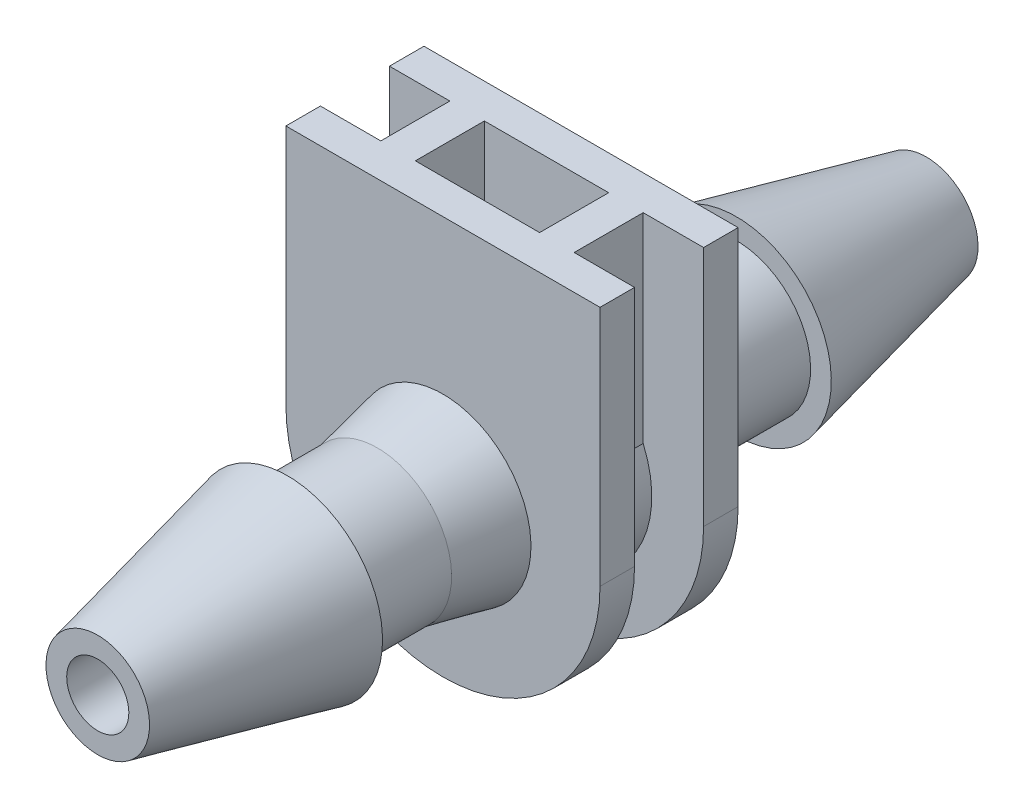
ISO-10303-21;
HEADER;
FILE_DESCRIPTION(('STEP AP214'),'2;1');
FILE_NAME('part.step','',(''),(''),'','','');
FILE_SCHEMA(('AUTOMOTIVE_DESIGN { 1 0 10303 214 1 1 1 1 }'));
ENDSEC;
DATA;
#1=APPLICATION_CONTEXT('core data for automotive mechanical design processes');
#2=APPLICATION_PROTOCOL_DEFINITION('international standard','automotive_design',2000,#1);
#3=PRODUCT_CONTEXT('',#1,'mechanical');
#4=PRODUCT('Part','Part','',(#3));
#5=PRODUCT_RELATED_PRODUCT_CATEGORY('part','',(#4));
#6=PRODUCT_DEFINITION_FORMATION('','',#4);
#7=PRODUCT_DEFINITION_CONTEXT('part definition',#1,'design');
#8=PRODUCT_DEFINITION('design','',#6,#7);
#9=PRODUCT_DEFINITION_SHAPE('','',#8);
#10=(LENGTH_UNIT() NAMED_UNIT(*) SI_UNIT(.MILLI.,.METRE.));
#11=(NAMED_UNIT(*) PLANE_ANGLE_UNIT() SI_UNIT($,.RADIAN.));
#12=(NAMED_UNIT(*) SI_UNIT($,.STERADIAN.) SOLID_ANGLE_UNIT());
#13=UNCERTAINTY_MEASURE_WITH_UNIT(LENGTH_MEASURE(1.E-05),#10,'distance_accuracy_value','');
#14=(GEOMETRIC_REPRESENTATION_CONTEXT(3) GLOBAL_UNCERTAINTY_ASSIGNED_CONTEXT((#13)) GLOBAL_UNIT_ASSIGNED_CONTEXT((#10,
#11,#12)) REPRESENTATION_CONTEXT('',''));
#15=CARTESIAN_POINT('',(0.,0.,0.));
#16=DIRECTION('',(0.,0.,1.));
#17=DIRECTION('',(1.,0.,0.));
#18=AXIS2_PLACEMENT_3D('',#15,#16,#17);
#19=CARTESIAN_POINT('',(0.,0.,12.));
#20=DIRECTION('',(0.,0.,1.));
#21=DIRECTION('',(0.,-1.,0.));
#22=AXIS2_PLACEMENT_3D('',#19,#20,#21);
#23=CYLINDRICAL_SURFACE('',#22,0.899999999999998);
#24=CARTESIAN_POINT('',(0.,0.,2.));
#25=DIRECTION('',(0.,0.,-1.));
#26=DIRECTION('',(-1.,0.,0.));
#27=AXIS2_PLACEMENT_3D('',#24,#25,#26);
#28=CIRCLE('',#27,0.899999999999998);
#29=CARTESIAN_POINT('',(0.899999999999998,0.,2.));
#30=VERTEX_POINT('',#29);
#31=CARTESIAN_POINT('',(-0.899999999999998,0.,2.));
#32=VERTEX_POINT('',#31);
#33=EDGE_CURVE('E286',#30,#32,#28,.F.);
#34=ORIENTED_EDGE('',*,*,#33,.F.);
#35=DIRECTION('',(0.,0.,1.));
#36=VECTOR('',#35,1.);
#37=CARTESIAN_POINT('',(0.899999999999998,0.,12.));
#38=LINE('',#37,#36);
#39=CARTESIAN_POINT('',(0.899999999999998,0.,1.));
#40=VERTEX_POINT('',#39);
#41=EDGE_CURVE('E288',#40,#30,#38,.T.);
#42=ORIENTED_EDGE('',*,*,#41,.F.);
#43=CARTESIAN_POINT('',(0.,0.,1.));
#44=DIRECTION('',(0.,0.,-1.));
#45=DIRECTION('',(-1.,0.,0.));
#46=AXIS2_PLACEMENT_3D('',#43,#44,#45);
#47=CIRCLE('',#46,0.899999999999998);
#48=CARTESIAN_POINT('',(-0.899999999999998,0.,1.));
#49=VERTEX_POINT('',#48);
#50=EDGE_CURVE('E294',#40,#49,#47,.F.);
#51=ORIENTED_EDGE('',*,*,#50,.T.);
#52=DIRECTION('',(0.,0.,1.));
#53=VECTOR('',#52,1.);
#54=CARTESIAN_POINT('',(-0.899999999999998,0.,12.));
#55=LINE('',#54,#53);
#56=EDGE_CURVE('E293',#32,#49,#55,.F.);
#57=ORIENTED_EDGE('',*,*,#56,.F.);
#58=EDGE_LOOP('',(#34,#42,#51,#57));
#59=FACE_BOUND('',#58,.T.);
#60=CARTESIAN_POINT('',(0.,0.,-12.));
#61=DIRECTION('',(0.,0.,1.));
#62=DIRECTION('',(0.,-1.,0.));
#63=AXIS2_PLACEMENT_3D('',#60,#61,#62);
#64=CIRCLE('',#63,0.899999999999996);
#65=CARTESIAN_POINT('',(0.,-0.899999999999992,-12.));
#66=VERTEX_POINT('',#65);
#67=EDGE_CURVE('E11',#66,#66,#64,.T.);
#68=ORIENTED_EDGE('',*,*,#67,.F.);
#69=EDGE_LOOP('',(#68));
#70=FACE_BOUND('',#69,.T.);
#71=CARTESIAN_POINT('',(0.,0.,12.));
#72=DIRECTION('',(0.,0.,1.));
#73=DIRECTION('',(0.,-1.,0.));
#74=AXIS2_PLACEMENT_3D('',#71,#72,#73);
#75=CIRCLE('',#74,0.9);
#76=CARTESIAN_POINT('',(0.,-0.9,12.));
#77=VERTEX_POINT('',#76);
#78=EDGE_CURVE('E312',#77,#77,#75,.T.);
#79=ORIENTED_EDGE('',*,*,#78,.T.);
#80=EDGE_LOOP('',(#79));
#81=FACE_BOUND('',#80,.T.);
#82=CARTESIAN_POINT('',(0.,0.,-2.));
#83=DIRECTION('',(0.,0.,1.));
#84=DIRECTION('',(1.,0.,0.));
#85=AXIS2_PLACEMENT_3D('',#82,#83,#84);
#86=CIRCLE('',#85,0.899999999999998);
#87=CARTESIAN_POINT('',(-0.899999999999998,0.,-2.));
#88=VERTEX_POINT('',#87);
#89=CARTESIAN_POINT('',(0.899999999999998,0.,-2.));
#90=VERTEX_POINT('',#89);
#91=EDGE_CURVE('E310',#88,#90,#86,.F.);
#92=ORIENTED_EDGE('',*,*,#91,.F.);
#93=CARTESIAN_POINT('',(-0.899999999999998,0.,-1.));
#94=VERTEX_POINT('',#93);
#95=EDGE_CURVE('E291',#94,#88,#55,.F.);
#96=ORIENTED_EDGE('',*,*,#95,.F.);
#97=CARTESIAN_POINT('',(0.,0.,-1.));
#98=DIRECTION('',(0.,0.,1.));
#99=DIRECTION('',(1.,0.,0.));
#100=AXIS2_PLACEMENT_3D('',#97,#98,#99);
#101=CIRCLE('',#100,0.899999999999998);
#102=CARTESIAN_POINT('',(0.899999999999998,0.,-1.));
#103=VERTEX_POINT('',#102);
#104=EDGE_CURVE('E307',#94,#103,#101,.F.);
#105=ORIENTED_EDGE('',*,*,#104,.T.);
#106=EDGE_CURVE('E290',#90,#103,#38,.T.);
#107=ORIENTED_EDGE('',*,*,#106,.F.);
#108=EDGE_LOOP('',(#92,#96,#105,#107));
#109=FACE_BOUND('',#108,.T.);
#110=ADVANCED_FACE('F33',(#59,#70,#81,#109),#23,.F.);
#111=CARTESIAN_POINT('',(0.,0.,12.));
#112=DIRECTION('',(0.,0.,1.));
#113=DIRECTION('',(0.,-1.,0.));
#114=AXIS2_PLACEMENT_3D('',#111,#112,#113);
#115=CYLINDRICAL_SURFACE('',#114,4.55);
#116=DIRECTION('',(0.,0.,1.));
#117=VECTOR('',#116,1.);
#118=CARTESIAN_POINT('',(-4.55,0.,-2.));
#119=LINE('',#118,#117);
#120=CARTESIAN_POINT('',(-4.55,0.,-2.));
#121=VERTEX_POINT('',#120);
#122=CARTESIAN_POINT('',(-4.55,0.,-1.));
#123=VERTEX_POINT('',#122);
#124=EDGE_CURVE('E238',#121,#123,#119,.T.);
#125=ORIENTED_EDGE('',*,*,#124,.F.);
#126=CARTESIAN_POINT('',(0.,0.,-2.));
#127=DIRECTION('',(0.,0.,1.));
#128=DIRECTION('',(0.,-1.,0.));
#129=AXIS2_PLACEMENT_3D('',#126,#127,#128);
#130=CIRCLE('',#129,4.55);
#131=CARTESIAN_POINT('',(4.55,0.,-2.));
#132=VERTEX_POINT('',#131);
#133=EDGE_CURVE('E346',#121,#132,#130,.T.);
#134=ORIENTED_EDGE('',*,*,#133,.T.);
#135=DIRECTION('',(0.,0.,-1.));
#136=VECTOR('',#135,1.);
#137=CARTESIAN_POINT('',(4.55,0.,-1.));
#138=LINE('',#137,#136);
#139=CARTESIAN_POINT('',(4.55,0.,-1.));
#140=VERTEX_POINT('',#139);
#141=EDGE_CURVE('E209',#140,#132,#138,.T.);
#142=ORIENTED_EDGE('',*,*,#141,.F.);
#143=CARTESIAN_POINT('',(0.,0.,-1.));
#144=DIRECTION('',(0.,0.,1.));
#145=DIRECTION('',(0.,-1.,0.));
#146=AXIS2_PLACEMENT_3D('',#143,#144,#145);
#147=CIRCLE('',#146,4.55);
#148=EDGE_CURVE('E343',#123,#140,#147,.T.);
#149=ORIENTED_EDGE('',*,*,#148,.F.);
#150=EDGE_LOOP('',(#125,#134,#142,#149));
#151=FACE_BOUND('',#150,.T.);
#152=ADVANCED_FACE('F372',(#151),#115,.T.);
#153=CARTESIAN_POINT('',(0.,4.55,-1.));
#154=DIRECTION('',(0.,0.,-1.));
#155=DIRECTION('',(0.,1.,0.));
#156=AXIS2_PLACEMENT_3D('',#153,#154,#155);
#157=PLANE('',#156);
#158=CARTESIAN_POINT('',(0.,0.,-1.));
#159=DIRECTION('',(0.,0.,1.));
#160=DIRECTION('',(0.,-1.,0.));
#161=AXIS2_PLACEMENT_3D('',#158,#159,#160);
#162=CIRCLE('',#161,3.05);
#163=CARTESIAN_POINT('',(-2.8,1.20933866224478,-1.));
#164=VERTEX_POINT('',#163);
#165=CARTESIAN_POINT('',(2.8,1.20933866224478,-1.));
#166=VERTEX_POINT('',#165);
#167=EDGE_CURVE('E340',#164,#166,#162,.T.);
#168=ORIENTED_EDGE('',*,*,#167,.F.);
#169=DIRECTION('',(0.,-1.,0.));
#170=VECTOR('',#169,1.);
#171=CARTESIAN_POINT('',(-2.8,7.,-1.));
#172=LINE('',#171,#170);
#173=CARTESIAN_POINT('',(-2.8,7.,-1.));
#174=VERTEX_POINT('',#173);
#175=EDGE_CURVE('E277',#174,#164,#172,.T.);
#176=ORIENTED_EDGE('',*,*,#175,.F.);
#177=DIRECTION('',(1.,0.,0.));
#178=VECTOR('',#177,1.);
#179=CARTESIAN_POINT('',(-4.55,7.,-1.));
#180=LINE('',#179,#178);
#181=CARTESIAN_POINT('',(-4.55,7.,-1.));
#182=VERTEX_POINT('',#181);
#183=EDGE_CURVE('E211',#182,#174,#180,.T.);
#184=ORIENTED_EDGE('',*,*,#183,.F.);
#185=DIRECTION('',(0.,-1.,0.));
#186=VECTOR('',#185,1.);
#187=CARTESIAN_POINT('',(-4.55,7.,-1.));
#188=LINE('',#187,#186);
#189=EDGE_CURVE('E280',#182,#123,#188,.T.);
#190=ORIENTED_EDGE('',*,*,#189,.T.);
#191=ORIENTED_EDGE('',*,*,#148,.T.);
#192=DIRECTION('',(0.,-1.,0.));
#193=VECTOR('',#192,1.);
#194=CARTESIAN_POINT('',(4.55,7.,-1.));
#195=LINE('',#194,#193);
#196=CARTESIAN_POINT('',(4.55,7.,-1.));
#197=VERTEX_POINT('',#196);
#198=EDGE_CURVE('E254',#197,#140,#195,.T.);
#199=ORIENTED_EDGE('',*,*,#198,.F.);
#200=DIRECTION('',(1.,0.,0.));
#201=VECTOR('',#200,1.);
#202=CARTESIAN_POINT('',(2.8,7.,-1.));
#203=LINE('',#202,#201);
#204=CARTESIAN_POINT('',(2.8,7.,-1.));
#205=VERTEX_POINT('',#204);
#206=EDGE_CURVE('E231',#205,#197,#203,.T.);
#207=ORIENTED_EDGE('',*,*,#206,.F.);
#208=DIRECTION('',(0.,-1.,0.));
#209=VECTOR('',#208,1.);
#210=CARTESIAN_POINT('',(2.8,7.,-1.));
#211=LINE('',#210,#209);
#212=EDGE_CURVE('E257',#205,#166,#211,.T.);
#213=ORIENTED_EDGE('',*,*,#212,.T.);
#214=EDGE_LOOP('',(#168,#176,#184,#190,#191,#199,#207,#213));
#215=FACE_BOUND('',#214,.T.);
#216=ADVANCED_FACE('F472',(#215),#157,.F.);
#217=CARTESIAN_POINT('',(0.,0.,12.));
#218=DIRECTION('',(0.,0.,1.));
#219=DIRECTION('',(0.,-1.,0.));
#220=AXIS2_PLACEMENT_3D('',#217,#218,#219);
#221=CYLINDRICAL_SURFACE('',#220,3.05);
#222=DIRECTION('',(0.,0.,1.));
#223=VECTOR('',#222,1.);
#224=CARTESIAN_POINT('',(-2.8,1.20933866224477,12.));
#225=LINE('',#224,#223);
#226=CARTESIAN_POINT('',(-2.8,1.20933866224478,1.));
#227=VERTEX_POINT('',#226);
#228=EDGE_CURVE('E304',#164,#227,#225,.T.);
#229=ORIENTED_EDGE('',*,*,#228,.F.);
#230=ORIENTED_EDGE('',*,*,#167,.T.);
#231=DIRECTION('',(0.,0.,1.));
#232=VECTOR('',#231,1.);
#233=CARTESIAN_POINT('',(2.8,1.20933866224477,12.));
#234=LINE('',#233,#232);
#235=CARTESIAN_POINT('',(2.8,1.20933866224478,1.));
#236=VERTEX_POINT('',#235);
#237=EDGE_CURVE('E301',#236,#166,#234,.F.);
#238=ORIENTED_EDGE('',*,*,#237,.F.);
#239=CARTESIAN_POINT('',(0.,0.,1.));
#240=DIRECTION('',(0.,0.,1.));
#241=DIRECTION('',(0.,-1.,0.));
#242=AXIS2_PLACEMENT_3D('',#239,#240,#241);
#243=CIRCLE('',#242,3.05);
#244=EDGE_CURVE('E336',#227,#236,#243,.T.);
#245=ORIENTED_EDGE('',*,*,#244,.F.);
#246=EDGE_LOOP('',(#229,#230,#238,#245));
#247=FACE_BOUND('',#246,.T.);
#248=ADVANCED_FACE('F469',(#247),#221,.T.);
#249=CARTESIAN_POINT('',(0.,4.55,1.));
#250=DIRECTION('',(0.,0.,1.));
#251=DIRECTION('',(0.,-1.,0.));
#252=AXIS2_PLACEMENT_3D('',#249,#250,#251);
#253=PLANE('',#252);
#254=DIRECTION('',(0.,-1.,0.));
#255=VECTOR('',#254,1.);
#256=CARTESIAN_POINT('',(-2.8,7.,1.));
#257=LINE('',#256,#255);
#258=CARTESIAN_POINT('',(-2.8,7.,1.));
#259=VERTEX_POINT('',#258);
#260=EDGE_CURVE('E274',#259,#227,#257,.T.);
#261=ORIENTED_EDGE('',*,*,#260,.T.);
#262=ORIENTED_EDGE('',*,*,#244,.T.);
#263=DIRECTION('',(0.,-1.,0.));
#264=VECTOR('',#263,1.);
#265=CARTESIAN_POINT('',(2.8,7.,1.));
#266=LINE('',#265,#264);
#267=CARTESIAN_POINT('',(2.8,7.,1.));
#268=VERTEX_POINT('',#267);
#269=EDGE_CURVE('E259',#268,#236,#266,.T.);
#270=ORIENTED_EDGE('',*,*,#269,.F.);
#271=DIRECTION('',(-1.,0.,0.));
#272=VECTOR('',#271,1.);
#273=CARTESIAN_POINT('',(4.55,7.,1.));
#274=LINE('',#273,#272);
#275=CARTESIAN_POINT('',(4.55,7.,1.));
#276=VERTEX_POINT('',#275);
#277=EDGE_CURVE('E225',#276,#268,#274,.T.);
#278=ORIENTED_EDGE('',*,*,#277,.F.);
#279=DIRECTION('',(0.,-1.,0.));
#280=VECTOR('',#279,1.);
#281=CARTESIAN_POINT('',(4.55,7.,1.));
#282=LINE('',#281,#280);
#283=CARTESIAN_POINT('',(4.55,0.,1.));
#284=VERTEX_POINT('',#283);
#285=EDGE_CURVE('E262',#276,#284,#282,.T.);
#286=ORIENTED_EDGE('',*,*,#285,.T.);
#287=CARTESIAN_POINT('',(0.,0.,1.));
#288=DIRECTION('',(0.,0.,1.));
#289=DIRECTION('',(0.,-1.,0.));
#290=AXIS2_PLACEMENT_3D('',#287,#288,#289);
#291=CIRCLE('',#290,4.55);
#292=CARTESIAN_POINT('',(-4.55,0.,1.));
#293=VERTEX_POINT('',#292);
#294=EDGE_CURVE('E333',#293,#284,#291,.T.);
#295=ORIENTED_EDGE('',*,*,#294,.F.);
#296=DIRECTION('',(0.,-1.,0.));
#297=VECTOR('',#296,1.);
#298=CARTESIAN_POINT('',(-4.55,7.,1.));
#299=LINE('',#298,#297);
#300=CARTESIAN_POINT('',(-4.55,7.,1.));
#301=VERTEX_POINT('',#300);
#302=EDGE_CURVE('E271',#301,#293,#299,.T.);
#303=ORIENTED_EDGE('',*,*,#302,.F.);
#304=DIRECTION('',(-1.,0.,0.));
#305=VECTOR('',#304,1.);
#306=CARTESIAN_POINT('',(-2.8,7.,1.));
#307=LINE('',#306,#305);
#308=EDGE_CURVE('E217',#259,#301,#307,.T.);
#309=ORIENTED_EDGE('',*,*,#308,.F.);
#310=EDGE_LOOP('',(#261,#262,#270,#278,#286,#295,#303,#309));
#311=FACE_BOUND('',#310,.T.);
#312=ADVANCED_FACE('F459',(#311),#253,.F.);
#313=CARTESIAN_POINT('',(0.,0.,12.));
#314=DIRECTION('',(0.,0.,1.));
#315=DIRECTION('',(0.,-1.,0.));
#316=AXIS2_PLACEMENT_3D('',#313,#314,#315);
#317=CYLINDRICAL_SURFACE('',#316,4.55);
#318=DIRECTION('',(0.,0.,1.));
#319=VECTOR('',#318,1.);
#320=CARTESIAN_POINT('',(-4.55,0.,1.));
#321=LINE('',#320,#319);
#322=CARTESIAN_POINT('',(-4.55,0.,2.));
#323=VERTEX_POINT('',#322);
#324=EDGE_CURVE('E241',#293,#323,#321,.T.);
#325=ORIENTED_EDGE('',*,*,#324,.F.);
#326=ORIENTED_EDGE('',*,*,#294,.T.);
#327=DIRECTION('',(0.,0.,-1.));
#328=VECTOR('',#327,1.);
#329=CARTESIAN_POINT('',(4.55,0.,2.));
#330=LINE('',#329,#328);
#331=CARTESIAN_POINT('',(4.55,0.,2.));
#332=VERTEX_POINT('',#331);
#333=EDGE_CURVE('E247',#332,#284,#330,.T.);
#334=ORIENTED_EDGE('',*,*,#333,.F.);
#335=CARTESIAN_POINT('',(0.,0.,2.));
#336=DIRECTION('',(0.,0.,1.));
#337=DIRECTION('',(0.,-1.,0.));
#338=AXIS2_PLACEMENT_3D('',#335,#336,#337);
#339=CIRCLE('',#338,4.55);
#340=EDGE_CURVE('E330',#323,#332,#339,.T.);
#341=ORIENTED_EDGE('',*,*,#340,.F.);
#342=EDGE_LOOP('',(#325,#326,#334,#341));
#343=FACE_BOUND('',#342,.T.);
#344=ADVANCED_FACE('F367',(#343),#317,.T.);
#345=CARTESIAN_POINT('',(0.,1.5,-12.));
#346=DIRECTION('',(0.,0.,1.));
#347=DIRECTION('',(0.,-1.,0.));
#348=AXIS2_PLACEMENT_3D('',#345,#346,#347);
#349=PLANE('',#348);
#350=CARTESIAN_POINT('',(0.,0.,-12.));
#351=DIRECTION('',(0.,0.,1.));
#352=DIRECTION('',(0.,-1.,0.));
#353=AXIS2_PLACEMENT_3D('',#350,#351,#352);
#354=CIRCLE('',#353,1.5);
#355=CARTESIAN_POINT('',(0.,-1.49999999999999,-12.));
#356=VERTEX_POINT('',#355);
#357=EDGE_CURVE('E40',#356,#356,#354,.T.);
#358=ORIENTED_EDGE('',*,*,#357,.F.);
#359=EDGE_LOOP('',(#358));
#360=FACE_BOUND('',#359,.T.);
#361=ORIENTED_EDGE('',*,*,#67,.T.);
#362=EDGE_LOOP('',(#361));
#363=FACE_BOUND('',#362,.T.);
#364=ADVANCED_FACE('F364',(#360,#363),#349,.F.);
#365=CARTESIAN_POINT('',(0.,0.,-12.));
#366=DIRECTION('',(0.,0.,1.));
#367=DIRECTION('',(0.,-1.,0.));
#368=AXIS2_PLACEMENT_3D('',#365,#366,#367);
#369=CONICAL_SURFACE('',#368,1.5,0.223476601140633);
#370=CARTESIAN_POINT('',(0.,0.,-6.5));
#371=DIRECTION('',(0.,0.,1.));
#372=DIRECTION('',(0.,-1.,0.));
#373=AXIS2_PLACEMENT_3D('',#370,#371,#372);
#374=CIRCLE('',#373,2.75);
#375=CARTESIAN_POINT('',(0.,-2.74999999999999,-6.5));
#376=VERTEX_POINT('',#375);
#377=EDGE_CURVE('E357',#376,#376,#374,.T.);
#378=ORIENTED_EDGE('',*,*,#377,.F.);
#379=EDGE_LOOP('',(#378));
#380=FACE_BOUND('',#379,.T.);
#381=ORIENTED_EDGE('',*,*,#357,.T.);
#382=EDGE_LOOP('',(#381));
#383=FACE_BOUND('',#382,.T.);
#384=ADVANCED_FACE('F362',(#380,#383),#369,.T.);
#385=CARTESIAN_POINT('',(0.,2.75,-6.5));
#386=DIRECTION('',(0.,0.,-1.));
#387=DIRECTION('',(0.,1.,0.));
#388=AXIS2_PLACEMENT_3D('',#385,#386,#387);
#389=PLANE('',#388);
#390=CARTESIAN_POINT('',(0.,0.,-6.5));
#391=DIRECTION('',(0.,0.,1.));
#392=DIRECTION('',(0.,-1.,0.));
#393=AXIS2_PLACEMENT_3D('',#390,#391,#392);
#394=CIRCLE('',#393,2.15);
#395=CARTESIAN_POINT('',(0.,-2.14999999999999,-6.5));
#396=VERTEX_POINT('',#395);
#397=EDGE_CURVE('E354',#396,#396,#394,.T.);
#398=ORIENTED_EDGE('',*,*,#397,.F.);
#399=EDGE_LOOP('',(#398));
#400=FACE_BOUND('',#399,.T.);
#401=ORIENTED_EDGE('',*,*,#377,.T.);
#402=EDGE_LOOP('',(#401));
#403=FACE_BOUND('',#402,.T.);
#404=ADVANCED_FACE('F486',(#400,#403),#389,.F.);
#405=CARTESIAN_POINT('',(0.,0.,12.));
#406=DIRECTION('',(0.,0.,1.));
#407=DIRECTION('',(0.,-1.,0.));
#408=AXIS2_PLACEMENT_3D('',#405,#406,#407);
#409=CYLINDRICAL_SURFACE('',#408,2.15);
#410=CARTESIAN_POINT('',(0.,0.,-3.9));
#411=DIRECTION('',(0.,0.,1.));
#412=DIRECTION('',(0.,-1.,0.));
#413=AXIS2_PLACEMENT_3D('',#410,#411,#412);
#414=CIRCLE('',#413,2.15);
#415=CARTESIAN_POINT('',(0.,-2.14999999999999,-3.9));
#416=VERTEX_POINT('',#415);
#417=EDGE_CURVE('E351',#416,#416,#414,.T.);
#418=ORIENTED_EDGE('',*,*,#417,.F.);
#419=EDGE_LOOP('',(#418));
#420=FACE_BOUND('',#419,.T.);
#421=ORIENTED_EDGE('',*,*,#397,.T.);
#422=EDGE_LOOP('',(#421));
#423=FACE_BOUND('',#422,.T.);
#424=ADVANCED_FACE('F482',(#420,#423),#409,.T.);
#425=CARTESIAN_POINT('',(0.,0.,-3.9));
#426=DIRECTION('',(0.,0.,1.));
#427=DIRECTION('',(0.,-1.,0.));
#428=AXIS2_PLACEMENT_3D('',#425,#426,#427);
#429=CONICAL_SURFACE('',#428,2.15,0.207496226435205);
#430=CARTESIAN_POINT('',(0.,0.,-2.00000000000001));
#431=DIRECTION('',(0.,0.,1.));
#432=DIRECTION('',(0.,-1.,0.));
#433=AXIS2_PLACEMENT_3D('',#430,#431,#432);
#434=CIRCLE('',#433,2.55);
#435=CARTESIAN_POINT('',(0.,-2.55,-2.00000000000001));
#436=VERTEX_POINT('',#435);
#437=EDGE_CURVE('E348',#436,#436,#434,.T.);
#438=ORIENTED_EDGE('',*,*,#437,.F.);
#439=EDGE_LOOP('',(#438));
#440=FACE_BOUND('',#439,.T.);
#441=ORIENTED_EDGE('',*,*,#417,.T.);
#442=EDGE_LOOP('',(#441));
#443=FACE_BOUND('',#442,.T.);
#444=ADVANCED_FACE('F478',(#440,#443),#429,.T.);
#445=CARTESIAN_POINT('',(0.,4.55,-2.00000000000001));
#446=DIRECTION('',(0.,0.,1.));
#447=DIRECTION('',(0.,-1.,0.));
#448=AXIS2_PLACEMENT_3D('',#445,#446,#447);
#449=PLANE('',#448);
#450=ORIENTED_EDGE('',*,*,#437,.T.);
#451=EDGE_LOOP('',(#450));
#452=FACE_BOUND('',#451,.T.);
#453=DIRECTION('',(0.,-1.,0.));
#454=VECTOR('',#453,1.);
#455=CARTESIAN_POINT('',(4.55,7.,-2.));
#456=LINE('',#455,#454);
#457=CARTESIAN_POINT('',(4.55,7.,-2.));
#458=VERTEX_POINT('',#457);
#459=EDGE_CURVE('E235',#458,#132,#456,.T.);
#460=ORIENTED_EDGE('',*,*,#459,.T.);
#461=ORIENTED_EDGE('',*,*,#133,.F.);
#462=DIRECTION('',(0.,-1.,0.));
#463=VECTOR('',#462,1.);
#464=CARTESIAN_POINT('',(-4.55,7.,-2.));
#465=LINE('',#464,#463);
#466=CARTESIAN_POINT('',(-4.55,7.,-2.));
#467=VERTEX_POINT('',#466);
#468=EDGE_CURVE('E283',#467,#121,#465,.T.);
#469=ORIENTED_EDGE('',*,*,#468,.F.);
#470=DIRECTION('',(-1.,0.,0.));
#471=VECTOR('',#470,1.);
#472=CARTESIAN_POINT('',(4.55,7.,-2.));
#473=LINE('',#472,#471);
#474=EDGE_CURVE('E205',#458,#467,#473,.T.);
#475=ORIENTED_EDGE('',*,*,#474,.F.);
#476=EDGE_LOOP('',(#460,#461,#469,#475));
#477=FACE_BOUND('',#476,.T.);
#478=ADVANCED_FACE('F455',(#452,#477),#449,.F.);
#479=CARTESIAN_POINT('',(0.,4.55,2.00000000000001));
#480=DIRECTION('',(0.,0.,-1.));
#481=DIRECTION('',(0.,1.,0.));
#482=AXIS2_PLACEMENT_3D('',#479,#480,#481);
#483=PLANE('',#482);
#484=CARTESIAN_POINT('',(0.,0.,2.00000000000001));
#485=DIRECTION('',(0.,0.,1.));
#486=DIRECTION('',(0.,-1.,0.));
#487=AXIS2_PLACEMENT_3D('',#484,#485,#486);
#488=CIRCLE('',#487,2.55);
#489=CARTESIAN_POINT('',(0.,-2.55,2.00000000000001));
#490=VERTEX_POINT('',#489);
#491=EDGE_CURVE('E327',#490,#490,#488,.T.);
#492=ORIENTED_EDGE('',*,*,#491,.F.);
#493=EDGE_LOOP('',(#492));
#494=FACE_BOUND('',#493,.T.);
#495=ORIENTED_EDGE('',*,*,#340,.T.);
#496=DIRECTION('',(0.,-1.,0.));
#497=VECTOR('',#496,1.);
#498=CARTESIAN_POINT('',(4.55,7.,2.));
#499=LINE('',#498,#497);
#500=CARTESIAN_POINT('',(4.55,7.,2.));
#501=VERTEX_POINT('',#500);
#502=EDGE_CURVE('E265',#501,#332,#499,.T.);
#503=ORIENTED_EDGE('',*,*,#502,.F.);
#504=DIRECTION('',(1.,0.,0.));
#505=VECTOR('',#504,1.);
#506=CARTESIAN_POINT('',(-4.55,7.,2.));
#507=LINE('',#506,#505);
#508=CARTESIAN_POINT('',(-4.55,7.,2.));
#509=VERTEX_POINT('',#508);
#510=EDGE_CURVE('E221',#509,#501,#507,.T.);
#511=ORIENTED_EDGE('',*,*,#510,.F.);
#512=DIRECTION('',(0.,-1.,0.));
#513=VECTOR('',#512,1.);
#514=CARTESIAN_POINT('',(-4.55,7.,2.));
#515=LINE('',#514,#513);
#516=EDGE_CURVE('E268',#509,#323,#515,.T.);
#517=ORIENTED_EDGE('',*,*,#516,.T.);
#518=EDGE_LOOP('',(#495,#503,#511,#517));
#519=FACE_BOUND('',#518,.T.);
#520=ADVANCED_FACE('F451',(#494,#519),#483,.F.);
#521=CARTESIAN_POINT('',(0.,0.,2.00000000000001));
#522=DIRECTION('',(0.,0.,-1.));
#523=DIRECTION('',(0.,1.,0.));
#524=AXIS2_PLACEMENT_3D('',#521,#522,#523);
#525=CONICAL_SURFACE('',#524,2.55,0.207496226435204);
#526=CARTESIAN_POINT('',(0.,0.,3.9));
#527=DIRECTION('',(0.,0.,1.));
#528=DIRECTION('',(0.,-1.,0.));
#529=AXIS2_PLACEMENT_3D('',#526,#527,#528);
#530=CIRCLE('',#529,2.15);
#531=CARTESIAN_POINT('',(0.,-2.15,3.9));
#532=VERTEX_POINT('',#531);
#533=EDGE_CURVE('E324',#532,#532,#530,.T.);
#534=ORIENTED_EDGE('',*,*,#533,.F.);
#535=EDGE_LOOP('',(#534));
#536=FACE_BOUND('',#535,.T.);
#537=ORIENTED_EDGE('',*,*,#491,.T.);
#538=EDGE_LOOP('',(#537));
#539=FACE_BOUND('',#538,.T.);
#540=ADVANCED_FACE('F447',(#536,#539),#525,.T.);
#541=CARTESIAN_POINT('',(0.,0.,12.));
#542=DIRECTION('',(0.,0.,1.));
#543=DIRECTION('',(0.,-1.,0.));
#544=AXIS2_PLACEMENT_3D('',#541,#542,#543);
#545=CYLINDRICAL_SURFACE('',#544,2.15);
#546=CARTESIAN_POINT('',(0.,0.,6.5));
#547=DIRECTION('',(0.,0.,1.));
#548=DIRECTION('',(0.,-1.,0.));
#549=AXIS2_PLACEMENT_3D('',#546,#547,#548);
#550=CIRCLE('',#549,2.15);
#551=CARTESIAN_POINT('',(0.,-2.15,6.5));
#552=VERTEX_POINT('',#551);
#553=EDGE_CURVE('E321',#552,#552,#550,.T.);
#554=ORIENTED_EDGE('',*,*,#553,.F.);
#555=EDGE_LOOP('',(#554));
#556=FACE_BOUND('',#555,.T.);
#557=ORIENTED_EDGE('',*,*,#533,.T.);
#558=EDGE_LOOP('',(#557));
#559=FACE_BOUND('',#558,.T.);
#560=ADVANCED_FACE('F443',(#556,#559),#545,.T.);
#561=CARTESIAN_POINT('',(0.,2.75,6.5));
#562=DIRECTION('',(0.,0.,1.));
#563=DIRECTION('',(0.,-1.,0.));
#564=AXIS2_PLACEMENT_3D('',#561,#562,#563);
#565=PLANE('',#564);
#566=CARTESIAN_POINT('',(0.,0.,6.5));
#567=DIRECTION('',(0.,0.,1.));
#568=DIRECTION('',(0.,-1.,0.));
#569=AXIS2_PLACEMENT_3D('',#566,#567,#568);
#570=CIRCLE('',#569,2.75);
#571=CARTESIAN_POINT('',(0.,-2.75,6.5));
#572=VERTEX_POINT('',#571);
#573=EDGE_CURVE('E318',#572,#572,#570,.T.);
#574=ORIENTED_EDGE('',*,*,#573,.F.);
#575=EDGE_LOOP('',(#574));
#576=FACE_BOUND('',#575,.T.);
#577=ORIENTED_EDGE('',*,*,#553,.T.);
#578=EDGE_LOOP('',(#577));
#579=FACE_BOUND('',#578,.T.);
#580=ADVANCED_FACE('F439',(#576,#579),#565,.F.);
#581=CARTESIAN_POINT('',(0.,0.,6.5));
#582=DIRECTION('',(0.,0.,-1.));
#583=DIRECTION('',(0.,1.,0.));
#584=AXIS2_PLACEMENT_3D('',#581,#582,#583);
#585=CONICAL_SURFACE('',#584,2.75,0.223476601140633);
#586=CARTESIAN_POINT('',(0.,0.,12.));
#587=DIRECTION('',(0.,0.,1.));
#588=DIRECTION('',(0.,-1.,0.));
#589=AXIS2_PLACEMENT_3D('',#586,#587,#588);
#590=CIRCLE('',#589,1.5);
#591=CARTESIAN_POINT('',(0.,-1.5,12.));
#592=VERTEX_POINT('',#591);
#593=EDGE_CURVE('E315',#592,#592,#590,.T.);
#594=ORIENTED_EDGE('',*,*,#593,.F.);
#595=EDGE_LOOP('',(#594));
#596=FACE_BOUND('',#595,.T.);
#597=ORIENTED_EDGE('',*,*,#573,.T.);
#598=EDGE_LOOP('',(#597));
#599=FACE_BOUND('',#598,.T.);
#600=ADVANCED_FACE('F435',(#596,#599),#585,.T.);
#601=CARTESIAN_POINT('',(0.,1.5,12.));
#602=DIRECTION('',(0.,0.,-1.));
#603=DIRECTION('',(0.,1.,0.));
#604=AXIS2_PLACEMENT_3D('',#601,#602,#603);
#605=PLANE('',#604);
#606=ORIENTED_EDGE('',*,*,#78,.F.);
#607=EDGE_LOOP('',(#606));
#608=FACE_BOUND('',#607,.T.);
#609=ORIENTED_EDGE('',*,*,#593,.T.);
#610=EDGE_LOOP('',(#609));
#611=FACE_BOUND('',#610,.T.);
#612=ADVANCED_FACE('F409',(#608,#611),#605,.F.);
#613=CARTESIAN_POINT('',(4.55,7.,-1.));
#614=DIRECTION('',(-1.,0.,0.));
#615=DIRECTION('',(0.,0.,1.));
#616=AXIS2_PLACEMENT_3D('',#613,#614,#615);
#617=PLANE('',#616);
#618=ORIENTED_EDGE('',*,*,#141,.T.);
#619=ORIENTED_EDGE('',*,*,#459,.F.);
#620=DIRECTION('',(0.,0.,-1.));
#621=VECTOR('',#620,1.);
#622=CARTESIAN_POINT('',(4.55,7.,-1.));
#623=LINE('',#622,#621);
#624=EDGE_CURVE('E233',#197,#458,#623,.T.);
#625=ORIENTED_EDGE('',*,*,#624,.F.);
#626=ORIENTED_EDGE('',*,*,#198,.T.);
#627=EDGE_LOOP('',(#618,#619,#625,#626));
#628=FACE_BOUND('',#627,.T.);
#629=ADVANCED_FACE('F405',(#628),#617,.F.);
#630=CARTESIAN_POINT('',(4.55,7.,2.));
#631=DIRECTION('',(-1.,0.,0.));
#632=DIRECTION('',(0.,0.,1.));
#633=AXIS2_PLACEMENT_3D('',#630,#631,#632);
#634=PLANE('',#633);
#635=ORIENTED_EDGE('',*,*,#333,.T.);
#636=ORIENTED_EDGE('',*,*,#285,.F.);
#637=DIRECTION('',(0.,0.,-1.));
#638=VECTOR('',#637,1.);
#639=CARTESIAN_POINT('',(4.55,7.,2.));
#640=LINE('',#639,#638);
#641=EDGE_CURVE('E223',#501,#276,#640,.T.);
#642=ORIENTED_EDGE('',*,*,#641,.F.);
#643=ORIENTED_EDGE('',*,*,#502,.T.);
#644=EDGE_LOOP('',(#635,#636,#642,#643));
#645=FACE_BOUND('',#644,.T.);
#646=ADVANCED_FACE('F408',(#645),#634,.F.);
#647=CARTESIAN_POINT('',(-4.55,7.,1.));
#648=DIRECTION('',(1.,0.,0.));
#649=DIRECTION('',(0.,0.,-1.));
#650=AXIS2_PLACEMENT_3D('',#647,#648,#649);
#651=PLANE('',#650);
#652=ORIENTED_EDGE('',*,*,#324,.T.);
#653=ORIENTED_EDGE('',*,*,#516,.F.);
#654=DIRECTION('',(0.,0.,1.));
#655=VECTOR('',#654,1.);
#656=CARTESIAN_POINT('',(-4.55,7.,1.));
#657=LINE('',#656,#655);
#658=EDGE_CURVE('E219',#301,#509,#657,.T.);
#659=ORIENTED_EDGE('',*,*,#658,.F.);
#660=ORIENTED_EDGE('',*,*,#302,.T.);
#661=EDGE_LOOP('',(#652,#653,#659,#660));
#662=FACE_BOUND('',#661,.T.);
#663=ADVANCED_FACE('F415',(#662),#651,.F.);
#664=CARTESIAN_POINT('',(2.8,7.,1.));
#665=DIRECTION('',(-1.,0.,0.));
#666=DIRECTION('',(0.,0.,1.));
#667=AXIS2_PLACEMENT_3D('',#664,#665,#666);
#668=PLANE('',#667);
#669=ORIENTED_EDGE('',*,*,#269,.T.);
#670=ORIENTED_EDGE('',*,*,#237,.T.);
#671=ORIENTED_EDGE('',*,*,#212,.F.);
#672=DIRECTION('',(0.,0.,-1.));
#673=VECTOR('',#672,1.);
#674=CARTESIAN_POINT('',(2.8,7.,1.));
#675=LINE('',#674,#673);
#676=EDGE_CURVE('E228',#268,#205,#675,.T.);
#677=ORIENTED_EDGE('',*,*,#676,.F.);
#678=EDGE_LOOP('',(#669,#670,#671,#677));
#679=FACE_BOUND('',#678,.T.);
#680=ADVANCED_FACE('F411',(#679),#668,.F.);
#681=CARTESIAN_POINT('',(-2.8,7.,-1.));
#682=DIRECTION('',(1.,0.,0.));
#683=DIRECTION('',(0.,0.,-1.));
#684=AXIS2_PLACEMENT_3D('',#681,#682,#683);
#685=PLANE('',#684);
#686=ORIENTED_EDGE('',*,*,#175,.T.);
#687=ORIENTED_EDGE('',*,*,#228,.T.);
#688=ORIENTED_EDGE('',*,*,#260,.F.);
#689=DIRECTION('',(0.,0.,1.));
#690=VECTOR('',#689,1.);
#691=CARTESIAN_POINT('',(-2.8,7.,-1.));
#692=LINE('',#691,#690);
#693=EDGE_CURVE('E214',#174,#259,#692,.T.);
#694=ORIENTED_EDGE('',*,*,#693,.F.);
#695=EDGE_LOOP('',(#686,#687,#688,#694));
#696=FACE_BOUND('',#695,.T.);
#697=ADVANCED_FACE('F414',(#696),#685,.F.);
#698=CARTESIAN_POINT('',(-4.55,7.,-2.));
#699=DIRECTION('',(1.,0.,0.));
#700=DIRECTION('',(0.,0.,-1.));
#701=AXIS2_PLACEMENT_3D('',#698,#699,#700);
#702=PLANE('',#701);
#703=ORIENTED_EDGE('',*,*,#124,.T.);
#704=ORIENTED_EDGE('',*,*,#189,.F.);
#705=DIRECTION('',(0.,0.,1.));
#706=VECTOR('',#705,1.);
#707=CARTESIAN_POINT('',(-4.55,7.,-2.));
#708=LINE('',#707,#706);
#709=EDGE_CURVE('E208',#467,#182,#708,.T.);
#710=ORIENTED_EDGE('',*,*,#709,.F.);
#711=ORIENTED_EDGE('',*,*,#468,.T.);
#712=EDGE_LOOP('',(#703,#704,#710,#711));
#713=FACE_BOUND('',#712,.T.);
#714=ADVANCED_FACE('F399',(#713),#702,.F.);
#715=CARTESIAN_POINT('',(0.,7.,0.));
#716=DIRECTION('',(0.,1.,0.));
#717=DIRECTION('',(0.,0.,1.));
#718=AXIS2_PLACEMENT_3D('',#715,#716,#717);
#719=PLANE('',#718);
#720=ORIENTED_EDGE('',*,*,#474,.T.);
#721=ORIENTED_EDGE('',*,*,#709,.T.);
#722=ORIENTED_EDGE('',*,*,#183,.T.);
#723=ORIENTED_EDGE('',*,*,#693,.T.);
#724=ORIENTED_EDGE('',*,*,#308,.T.);
#725=ORIENTED_EDGE('',*,*,#658,.T.);
#726=ORIENTED_EDGE('',*,*,#510,.T.);
#727=ORIENTED_EDGE('',*,*,#641,.T.);
#728=ORIENTED_EDGE('',*,*,#277,.T.);
#729=ORIENTED_EDGE('',*,*,#676,.T.);
#730=ORIENTED_EDGE('',*,*,#206,.T.);
#731=ORIENTED_EDGE('',*,*,#624,.T.);
#732=EDGE_LOOP('',(#720,#721,#722,#723,#724,#725,#726,#727,#728,#729,#730,#731));
#733=FACE_BOUND('',#732,.T.);
#734=DIRECTION('',(0.,0.,1.));
#735=VECTOR('',#734,1.);
#736=CARTESIAN_POINT('',(-1.8,7.,-1.));
#737=LINE('',#736,#735);
#738=CARTESIAN_POINT('',(-1.8,7.,-1.));
#739=VERTEX_POINT('',#738);
#740=CARTESIAN_POINT('',(-1.8,7.,1.));
#741=VERTEX_POINT('',#740);
#742=EDGE_CURVE('E172',#739,#741,#737,.T.);
#743=ORIENTED_EDGE('',*,*,#742,.F.);
#744=DIRECTION('',(-1.,0.,0.));
#745=VECTOR('',#744,1.);
#746=CARTESIAN_POINT('',(1.8,7.,-1.));
#747=LINE('',#746,#745);
#748=CARTESIAN_POINT('',(1.8,7.,-1.));
#749=VERTEX_POINT('',#748);
#750=EDGE_CURVE('E184',#749,#739,#747,.T.);
#751=ORIENTED_EDGE('',*,*,#750,.F.);
#752=DIRECTION('',(0.,0.,-1.));
#753=VECTOR('',#752,1.);
#754=CARTESIAN_POINT('',(1.8,7.,1.));
#755=LINE('',#754,#753);
#756=CARTESIAN_POINT('',(1.8,7.,1.));
#757=VERTEX_POINT('',#756);
#758=EDGE_CURVE('E195',#757,#749,#755,.T.);
#759=ORIENTED_EDGE('',*,*,#758,.F.);
#760=DIRECTION('',(1.,0.,0.));
#761=VECTOR('',#760,1.);
#762=CARTESIAN_POINT('',(-1.8,7.,1.));
#763=LINE('',#762,#761);
#764=EDGE_CURVE('E193',#741,#757,#763,.T.);
#765=ORIENTED_EDGE('',*,*,#764,.F.);
#766=EDGE_LOOP('',(#743,#751,#759,#765));
#767=FACE_BOUND('',#766,.T.);
#768=ADVANCED_FACE('F191',(#733,#767),#719,.T.);
#769=CARTESIAN_POINT('',(1.8,7.,1.));
#770=DIRECTION('',(-1.,0.,0.));
#771=DIRECTION('',(0.,0.,1.));
#772=AXIS2_PLACEMENT_3D('',#769,#770,#771);
#773=PLANE('',#772);
#774=DIRECTION('',(0.,0.,1.));
#775=VECTOR('',#774,1.);
#776=CARTESIAN_POINT('',(1.8,2.46221445044902,12.));
#777=LINE('',#776,#775);
#778=CARTESIAN_POINT('',(1.8,2.46221445044903,1.));
#779=VERTEX_POINT('',#778);
#780=CARTESIAN_POINT('',(1.8,2.46221445044903,-1.));
#781=VERTEX_POINT('',#780);
#782=EDGE_CURVE('E297',#779,#781,#777,.F.);
#783=ORIENTED_EDGE('',*,*,#782,.F.);
#784=DIRECTION('',(0.,-1.,0.));
#785=VECTOR('',#784,1.);
#786=CARTESIAN_POINT('',(1.8,7.,1.));
#787=LINE('',#786,#785);
#788=EDGE_CURVE('E202',#757,#779,#787,.T.);
#789=ORIENTED_EDGE('',*,*,#788,.F.);
#790=ORIENTED_EDGE('',*,*,#758,.T.);
#791=DIRECTION('',(0.,-1.,0.));
#792=VECTOR('',#791,1.);
#793=CARTESIAN_POINT('',(1.8,7.,-1.));
#794=LINE('',#793,#792);
#795=EDGE_CURVE('E186',#749,#781,#794,.T.);
#796=ORIENTED_EDGE('',*,*,#795,.T.);
#797=EDGE_LOOP('',(#783,#789,#790,#796));
#798=FACE_BOUND('',#797,.T.);
#799=ADVANCED_FACE('F398',(#798),#773,.T.);
#800=CARTESIAN_POINT('',(-1.8,7.,-1.));
#801=DIRECTION('',(1.,0.,0.));
#802=DIRECTION('',(0.,0.,-1.));
#803=AXIS2_PLACEMENT_3D('',#800,#801,#802);
#804=PLANE('',#803);
#805=DIRECTION('',(0.,0.,1.));
#806=VECTOR('',#805,1.);
#807=CARTESIAN_POINT('',(-1.8,2.46221445044903,12.));
#808=LINE('',#807,#806);
#809=CARTESIAN_POINT('',(-1.8,2.46221445044903,-1.));
#810=VERTEX_POINT('',#809);
#811=CARTESIAN_POINT('',(-1.8,2.46221445044903,1.));
#812=VERTEX_POINT('',#811);
#813=EDGE_CURVE('E175',#810,#812,#808,.T.);
#814=ORIENTED_EDGE('',*,*,#813,.F.);
#815=DIRECTION('',(0.,-1.,0.));
#816=VECTOR('',#815,1.);
#817=CARTESIAN_POINT('',(-1.8,7.,-1.));
#818=LINE('',#817,#816);
#819=EDGE_CURVE('E168',#739,#810,#818,.T.);
#820=ORIENTED_EDGE('',*,*,#819,.F.);
#821=ORIENTED_EDGE('',*,*,#742,.T.);
#822=DIRECTION('',(0.,-1.,0.));
#823=VECTOR('',#822,1.);
#824=CARTESIAN_POINT('',(-1.8,7.,1.));
#825=LINE('',#824,#823);
#826=EDGE_CURVE('E180',#741,#812,#825,.T.);
#827=ORIENTED_EDGE('',*,*,#826,.T.);
#828=EDGE_LOOP('',(#814,#820,#821,#827));
#829=FACE_BOUND('',#828,.T.);
#830=ADVANCED_FACE('F170',(#829),#804,.T.);
#831=EDGE_CURVE('E335',#779,#812,#243,.T.);
#832=ORIENTED_EDGE('',*,*,#831,.T.);
#833=ORIENTED_EDGE('',*,*,#826,.F.);
#834=ORIENTED_EDGE('',*,*,#764,.T.);
#835=ORIENTED_EDGE('',*,*,#788,.T.);
#836=EDGE_LOOP('',(#832,#833,#834,#835));
#837=FACE_BOUND('',#836,.T.);
#838=ADVANCED_FACE('F461',(#837),#253,.F.);
#839=EDGE_CURVE('E339',#781,#810,#162,.T.);
#840=ORIENTED_EDGE('',*,*,#839,.T.);
#841=ORIENTED_EDGE('',*,*,#813,.T.);
#842=ORIENTED_EDGE('',*,*,#831,.F.);
#843=ORIENTED_EDGE('',*,*,#782,.T.);
#844=EDGE_LOOP('',(#840,#841,#842,#843));
#845=FACE_BOUND('',#844,.T.);
#846=ADVANCED_FACE('F464',(#845),#221,.T.);
#847=ORIENTED_EDGE('',*,*,#839,.F.);
#848=ORIENTED_EDGE('',*,*,#795,.F.);
#849=ORIENTED_EDGE('',*,*,#750,.T.);
#850=ORIENTED_EDGE('',*,*,#819,.T.);
#851=EDGE_LOOP('',(#847,#848,#849,#850));
#852=FACE_BOUND('',#851,.T.);
#853=ADVANCED_FACE('F185',(#852),#157,.F.);
#854=CARTESIAN_POINT('',(-1.8,7.,1.));
#855=DIRECTION('',(0.,0.,-1.));
#856=DIRECTION('',(-1.,0.,0.));
#857=AXIS2_PLACEMENT_3D('',#854,#855,#856);
#858=PLANE('',#857);
#859=ORIENTED_EDGE('',*,*,#50,.F.);
#860=DIRECTION('',(1.,0.,0.));
#861=VECTOR('',#860,1.);
#862=CARTESIAN_POINT('',(-1.8,0.,1.));
#863=LINE('',#862,#861);
#864=EDGE_CURVE('E53',#49,#40,#863,.T.);
#865=ORIENTED_EDGE('',*,*,#864,.F.);
#866=EDGE_LOOP('',(#859,#865));
#867=FACE_BOUND('',#866,.T.);
#868=ADVANCED_FACE('F422',(#867),#858,.T.);
#869=CARTESIAN_POINT('',(-4.55,7.,2.));
#870=DIRECTION('',(0.,0.,-1.));
#871=DIRECTION('',(-1.,0.,0.));
#872=AXIS2_PLACEMENT_3D('',#869,#870,#871);
#873=PLANE('',#872);
#874=DIRECTION('',(1.,0.,0.));
#875=VECTOR('',#874,1.);
#876=CARTESIAN_POINT('',(-4.55,0.,2.));
#877=LINE('',#876,#875);
#878=EDGE_CURVE('E244',#32,#30,#877,.T.);
#879=ORIENTED_EDGE('',*,*,#878,.T.);
#880=ORIENTED_EDGE('',*,*,#33,.T.);
#881=EDGE_LOOP('',(#879,#880));
#882=FACE_BOUND('',#881,.T.);
#883=ADVANCED_FACE('F403',(#882),#873,.F.);
#884=CARTESIAN_POINT('',(0.,0.,0.));
#885=DIRECTION('',(0.,1.,0.));
#886=DIRECTION('',(0.,0.,1.));
#887=AXIS2_PLACEMENT_3D('',#884,#885,#886);
#888=PLANE('',#887);
#889=ORIENTED_EDGE('',*,*,#878,.F.);
#890=ORIENTED_EDGE('',*,*,#56,.T.);
#891=ORIENTED_EDGE('',*,*,#864,.T.);
#892=ORIENTED_EDGE('',*,*,#41,.T.);
#893=EDGE_LOOP('',(#889,#890,#891,#892));
#894=FACE_BOUND('',#893,.T.);
#895=ADVANCED_FACE('F392',(#894),#888,.F.);
#896=CARTESIAN_POINT('',(4.55,7.,-2.));
#897=DIRECTION('',(0.,0.,1.));
#898=DIRECTION('',(1.,0.,0.));
#899=AXIS2_PLACEMENT_3D('',#896,#897,#898);
#900=PLANE('',#899);
#901=DIRECTION('',(-1.,0.,0.));
#902=VECTOR('',#901,1.);
#903=CARTESIAN_POINT('',(4.55,0.,-2.));
#904=LINE('',#903,#902);
#905=EDGE_CURVE('E179',#90,#88,#904,.T.);
#906=ORIENTED_EDGE('',*,*,#905,.T.);
#907=ORIENTED_EDGE('',*,*,#91,.T.);
#908=EDGE_LOOP('',(#906,#907));
#909=FACE_BOUND('',#908,.T.);
#910=ADVANCED_FACE('F381',(#909),#900,.F.);
#911=CARTESIAN_POINT('',(1.8,7.,-1.));
#912=DIRECTION('',(0.,0.,1.));
#913=DIRECTION('',(1.,0.,0.));
#914=AXIS2_PLACEMENT_3D('',#911,#912,#913);
#915=PLANE('',#914);
#916=ORIENTED_EDGE('',*,*,#104,.F.);
#917=DIRECTION('',(-1.,0.,0.));
#918=VECTOR('',#917,1.);
#919=CARTESIAN_POINT('',(1.8,0.,-1.));
#920=LINE('',#919,#918);
#921=EDGE_CURVE('E46',#103,#94,#920,.T.);
#922=ORIENTED_EDGE('',*,*,#921,.F.);
#923=EDGE_LOOP('',(#916,#922));
#924=FACE_BOUND('',#923,.T.);
#925=ADVANCED_FACE('F384',(#924),#915,.T.);
#926=ORIENTED_EDGE('',*,*,#921,.T.);
#927=ORIENTED_EDGE('',*,*,#95,.T.);
#928=ORIENTED_EDGE('',*,*,#905,.F.);
#929=ORIENTED_EDGE('',*,*,#106,.T.);
#930=EDGE_LOOP('',(#926,#927,#928,#929));
#931=FACE_BOUND('',#930,.T.);
#932=ADVANCED_FACE('F383',(#931),#888,.F.);
#933=CLOSED_SHELL('',(#110,#152,#216,#248,#312,#344,#364,#384,#404,#424,#444,#478,#520,#540,
#560,#580,#600,#612,#629,#646,#663,#680,#697,#714,#768,#799,#830,#838,#846,#853,#868,#883,#895,
#910,#925,#932));
#934=MANIFOLD_SOLID_BREP('B2',#933);
#935=ADVANCED_BREP_SHAPE_REPRESENTATION('',(#18,#934),#14);
#936=SHAPE_DEFINITION_REPRESENTATION(#9,#935);
ENDSEC;
END-ISO-10303-21;
